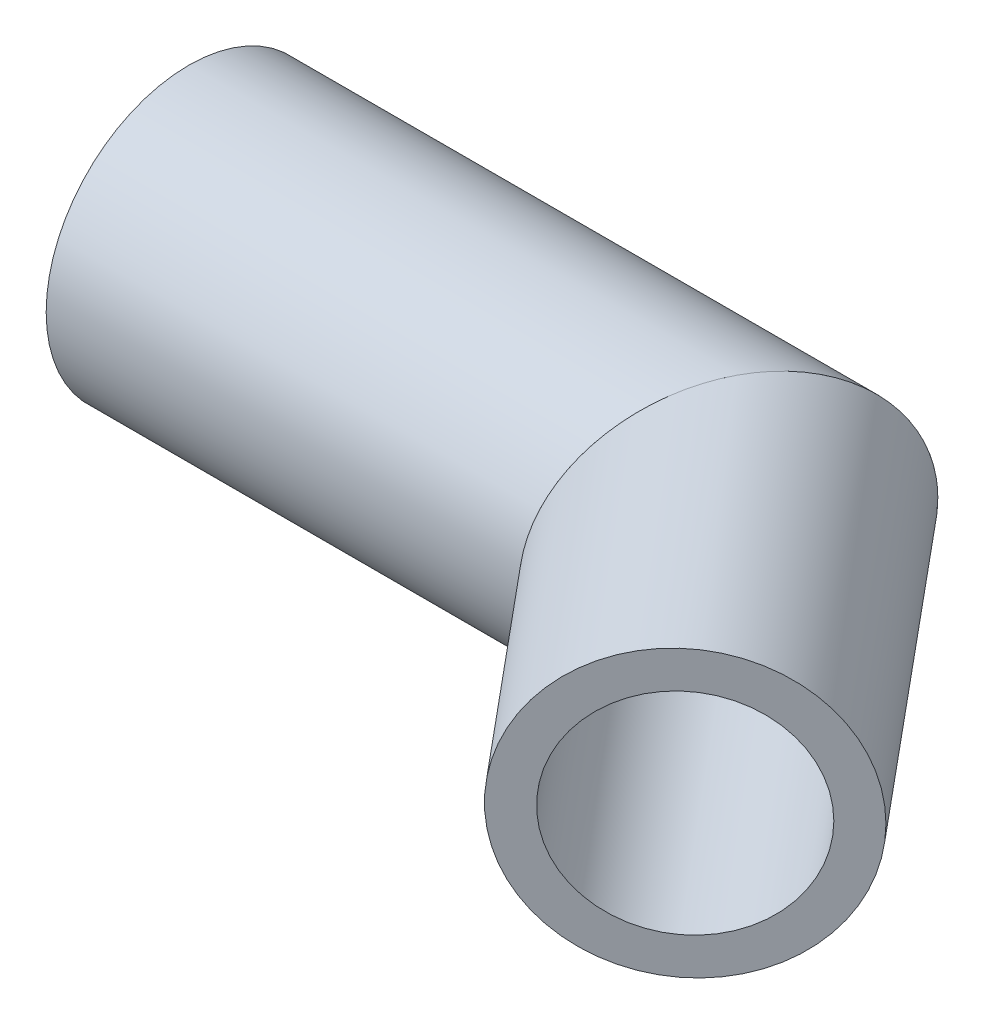
ISO-10303-21;
HEADER;
FILE_DESCRIPTION(('STEP AP214'),'2;1');
FILE_NAME('part.step','',(''),(''),'','','');
FILE_SCHEMA(('AUTOMOTIVE_DESIGN { 1 0 10303 214 1 1 1 1 }'));
ENDSEC;
DATA;
#1=APPLICATION_CONTEXT('core data for automotive mechanical design processes');
#2=APPLICATION_PROTOCOL_DEFINITION('international standard','automotive_design',2000,#1);
#3=PRODUCT_CONTEXT('',#1,'mechanical');
#4=PRODUCT('Part','Part','',(#3));
#5=PRODUCT_RELATED_PRODUCT_CATEGORY('part','',(#4));
#6=PRODUCT_DEFINITION_FORMATION('','',#4);
#7=PRODUCT_DEFINITION_CONTEXT('part definition',#1,'design');
#8=PRODUCT_DEFINITION('design','',#6,#7);
#9=PRODUCT_DEFINITION_SHAPE('','',#8);
#10=(LENGTH_UNIT() NAMED_UNIT(*) SI_UNIT(.MILLI.,.METRE.));
#11=(NAMED_UNIT(*) PLANE_ANGLE_UNIT() SI_UNIT($,.RADIAN.));
#12=(NAMED_UNIT(*) SI_UNIT($,.STERADIAN.) SOLID_ANGLE_UNIT());
#13=UNCERTAINTY_MEASURE_WITH_UNIT(LENGTH_MEASURE(1.E-05),#10,'distance_accuracy_value','');
#14=(GEOMETRIC_REPRESENTATION_CONTEXT(3) GLOBAL_UNCERTAINTY_ASSIGNED_CONTEXT((#13)) GLOBAL_UNIT_ASSIGNED_CONTEXT((#10,
#11,#12)) REPRESENTATION_CONTEXT('',''));
#15=CARTESIAN_POINT('',(0.,0.,0.));
#16=DIRECTION('',(0.,0.,1.));
#17=DIRECTION('',(1.,0.,0.));
#18=AXIS2_PLACEMENT_3D('',#15,#16,#17);
#19=CARTESIAN_POINT('',(40.389,0.,0.));
#20=DIRECTION('',(-1.,0.,0.));
#21=DIRECTION('',(0.,0.,1.));
#22=AXIS2_PLACEMENT_3D('',#19,#20,#21);
#23=CYLINDRICAL_SURFACE('',#22,7.8994);
#24=CARTESIAN_POINT('',(0.,0.,0.));
#25=DIRECTION('',(1.,0.,0.));
#26=DIRECTION('',(0.,0.,-1.));
#27=AXIS2_PLACEMENT_3D('',#24,#25,#26);
#28=CIRCLE('',#27,7.8994);
#29=CARTESIAN_POINT('',(0.,0.,-7.8994));
#30=VERTEX_POINT('',#29);
#31=EDGE_CURVE('E64',#30,#30,#28,.T.);
#32=ORIENTED_EDGE('',*,*,#31,.F.);
#33=EDGE_LOOP('',(#32));
#34=FACE_BOUND('',#33,.T.);
#35=CARTESIAN_POINT('',(40.389,0.,0.));
#36=DIRECTION('',(0.905383620897955,0.,0.424594511280714));
#37=DIRECTION('',(-0.424594511280714,0.,0.905383620897955));
#38=AXIS2_PLACEMENT_3D('',#35,#36,#37);
#39=ELLIPSE('',#38,8.72492037371453,7.8994);
#40=CARTESIAN_POINT('',(36.6844466979595,0.,7.8994));
#41=VERTEX_POINT('',#40);
#42=EDGE_CURVE('E59',#41,#41,#39,.T.);
#43=ORIENTED_EDGE('',*,*,#42,.T.);
#44=EDGE_LOOP('',(#43));
#45=FACE_BOUND('',#44,.T.);
#46=ADVANCED_FACE('F55',(#34,#45),#23,.F.);
#47=CARTESIAN_POINT('',(40.389,0.,0.));
#48=DIRECTION('',(-1.,0.,0.));
#49=DIRECTION('',(0.,0.,1.));
#50=AXIS2_PLACEMENT_3D('',#47,#48,#49);
#51=CYLINDRICAL_SURFACE('',#50,10.668);
#52=CARTESIAN_POINT('',(0.,0.,0.));
#53=DIRECTION('',(1.,0.,0.));
#54=DIRECTION('',(0.,0.,-1.));
#55=AXIS2_PLACEMENT_3D('',#52,#53,#54);
#56=CIRCLE('',#55,10.668);
#57=CARTESIAN_POINT('',(0.,0.,-10.668));
#58=VERTEX_POINT('',#57);
#59=EDGE_CURVE('E69',#58,#58,#56,.T.);
#60=ORIENTED_EDGE('',*,*,#59,.T.);
#61=EDGE_LOOP('',(#60));
#62=FACE_BOUND('',#61,.T.);
#63=CARTESIAN_POINT('',(40.389,0.,0.));
#64=DIRECTION('',(0.905383620897955,0.,0.424594511280714));
#65=DIRECTION('',(-0.424594511280714,0.,0.905383620897955));
#66=AXIS2_PLACEMENT_3D('',#63,#64,#65);
#67=ELLIPSE('',#66,11.7828506654666,10.668);
#68=CARTESIAN_POINT('',(35.3860662802026,0.,10.668));
#69=VERTEX_POINT('',#68);
#70=EDGE_CURVE('E12',#69,#69,#67,.T.);
#71=ORIENTED_EDGE('',*,*,#70,.F.);
#72=EDGE_LOOP('',(#71));
#73=FACE_BOUND('',#72,.T.);
#74=ADVANCED_FACE('F86',(#62,#73),#51,.T.);
#75=CARTESIAN_POINT('',(0.,0.,0.));
#76=DIRECTION('',(1.,0.,0.));
#77=DIRECTION('',(0.,0.,-1.));
#78=AXIS2_PLACEMENT_3D('',#75,#76,#77);
#79=PLANE('',#78);
#80=ORIENTED_EDGE('',*,*,#31,.T.);
#81=EDGE_LOOP('',(#80));
#82=FACE_BOUND('',#81,.T.);
#83=ORIENTED_EDGE('',*,*,#59,.F.);
#84=EDGE_LOOP('',(#83));
#85=FACE_BOUND('',#84,.T.);
#86=ADVANCED_FACE('F82',(#82,#85),#79,.F.);
#87=CARTESIAN_POINT('',(40.389,0.,0.));
#88=DIRECTION('',(0.905383620897955,0.,0.424594511280714));
#89=DIRECTION('',(0.424594511280714,0.,-0.905383620897955));
#90=AXIS2_PLACEMENT_3D('',#87,#88,#89);
#91=PLANE('',#90);
#92=ORIENTED_EDGE('',*,*,#42,.F.);
#93=EDGE_LOOP('',(#92));
#94=FACE_BOUND('',#93,.T.);
#95=ORIENTED_EDGE('',*,*,#70,.T.);
#96=EDGE_LOOP('',(#95));
#97=FACE_BOUND('',#96,.T.);
#98=ADVANCED_FACE('F57',(#94,#97),#91,.T.);
#99=CLOSED_SHELL('',(#46,#74,#86,#98));
#100=MANIFOLD_SOLID_BREP('B2',#99);
#101=CARTESIAN_POINT('',(56.3749750495146,0.,19.2210458018365));
#102=DIRECTION('',(-0.639439001980583,0.,-0.768841832073461));
#103=DIRECTION('',(-0.768841832073461,0.,0.639439001980583));
#104=AXIS2_PLACEMENT_3D('',#101,#102,#103);
#105=CYLINDRICAL_SURFACE('',#104,7.8994);
#106=CARTESIAN_POINT('',(56.3749750495146,0.,19.2210458018365));
#107=DIRECTION('',(0.639439001980583,0.,0.768841832073461));
#108=DIRECTION('',(0.768841832073461,0.,-0.639439001980583));
#109=AXIS2_PLACEMENT_3D('',#106,#107,#108);
#110=CIRCLE('',#109,7.8994);
#111=CARTESIAN_POINT('',(62.4483642177957,0.,14.1698613495911));
#112=VERTEX_POINT('',#111);
#113=EDGE_CURVE('E168',#112,#112,#110,.T.);
#114=ORIENTED_EDGE('',*,*,#113,.T.);
#115=EDGE_LOOP('',(#114));
#116=FACE_BOUND('',#115,.T.);
#117=CARTESIAN_POINT('',(40.389,0.,0.));
#118=DIRECTION('',(-0.905383620897955,0.,-0.424594511280714));
#119=DIRECTION('',(0.424594511280714,0.,-0.905383620897955));
#120=AXIS2_PLACEMENT_3D('',#117,#118,#119);
#121=ELLIPSE('',#120,8.72492037371453,7.8994);
#122=CARTESIAN_POINT('',(44.0935533020405,0.,-7.89940000000001));
#123=VERTEX_POINT('',#122);
#124=EDGE_CURVE('E158',#123,#123,#121,.T.);
#125=ORIENTED_EDGE('',*,*,#124,.T.);
#126=EDGE_LOOP('',(#125));
#127=FACE_BOUND('',#126,.T.);
#128=ADVANCED_FACE('F154',(#116,#127),#105,.F.);
#129=CARTESIAN_POINT('',(56.3749750495146,0.,19.2210458018365));
#130=DIRECTION('',(-0.639439001980583,0.,-0.768841832073461));
#131=DIRECTION('',(-0.768841832073461,0.,0.639439001980583));
#132=AXIS2_PLACEMENT_3D('',#129,#130,#131);
#133=CYLINDRICAL_SURFACE('',#132,10.668);
#134=CARTESIAN_POINT('',(56.3749750495146,0.,19.2210458018365));
#135=DIRECTION('',(0.639439001980583,0.,0.768841832073461));
#136=DIRECTION('',(0.768841832073461,0.,-0.639439001980583));
#137=AXIS2_PLACEMENT_3D('',#134,#135,#136);
#138=CIRCLE('',#137,10.668);
#139=CARTESIAN_POINT('',(64.5769797140743,0.,12.3995105287077));
#140=VERTEX_POINT('',#139);
#141=EDGE_CURVE('E162',#140,#140,#138,.T.);
#142=ORIENTED_EDGE('',*,*,#141,.F.);
#143=EDGE_LOOP('',(#142));
#144=FACE_BOUND('',#143,.T.);
#145=CARTESIAN_POINT('',(40.389,0.,0.));
#146=DIRECTION('',(-0.905383620897955,0.,-0.424594511280714));
#147=DIRECTION('',(0.424594511280714,0.,-0.905383620897955));
#148=AXIS2_PLACEMENT_3D('',#145,#146,#147);
#149=ELLIPSE('',#148,11.7828506654666,10.668);
#150=CARTESIAN_POINT('',(45.3919337197974,0.,-10.668));
#151=VERTEX_POINT('',#150);
#152=EDGE_CURVE('E54',#151,#151,#149,.T.);
#153=ORIENTED_EDGE('',*,*,#152,.F.);
#154=EDGE_LOOP('',(#153));
#155=FACE_BOUND('',#154,.T.);
#156=ADVANCED_FACE('F181',(#144,#155),#133,.T.);
#157=CARTESIAN_POINT('',(56.3749750495146,0.,19.2210458018365));
#158=DIRECTION('',(0.639439001980583,0.,0.768841832073461));
#159=DIRECTION('',(0.768841832073461,0.,-0.639439001980583));
#160=AXIS2_PLACEMENT_3D('',#157,#158,#159);
#161=PLANE('',#160);
#162=ORIENTED_EDGE('',*,*,#113,.F.);
#163=EDGE_LOOP('',(#162));
#164=FACE_BOUND('',#163,.T.);
#165=ORIENTED_EDGE('',*,*,#141,.T.);
#166=EDGE_LOOP('',(#165));
#167=FACE_BOUND('',#166,.T.);
#168=ADVANCED_FACE('F177',(#164,#167),#161,.T.);
#169=CARTESIAN_POINT('',(40.389,0.,0.));
#170=DIRECTION('',(-0.905383620897955,0.,-0.424594511280714));
#171=DIRECTION('',(-0.424594511280714,0.,0.905383620897955));
#172=AXIS2_PLACEMENT_3D('',#169,#170,#171);
#173=PLANE('',#172);
#174=ORIENTED_EDGE('',*,*,#124,.F.);
#175=EDGE_LOOP('',(#174));
#176=FACE_BOUND('',#175,.T.);
#177=ORIENTED_EDGE('',*,*,#152,.T.);
#178=EDGE_LOOP('',(#177));
#179=FACE_BOUND('',#178,.T.);
#180=ADVANCED_FACE('F156',(#176,#179),#173,.T.);
#181=CLOSED_SHELL('',(#128,#156,#168,#180));
#182=MANIFOLD_SOLID_BREP('B7',#181);
#183=ADVANCED_BREP_SHAPE_REPRESENTATION('',(#18,#100,#182),#14);
#184=SHAPE_DEFINITION_REPRESENTATION(#9,#183);
ENDSEC;
END-ISO-10303-21;
